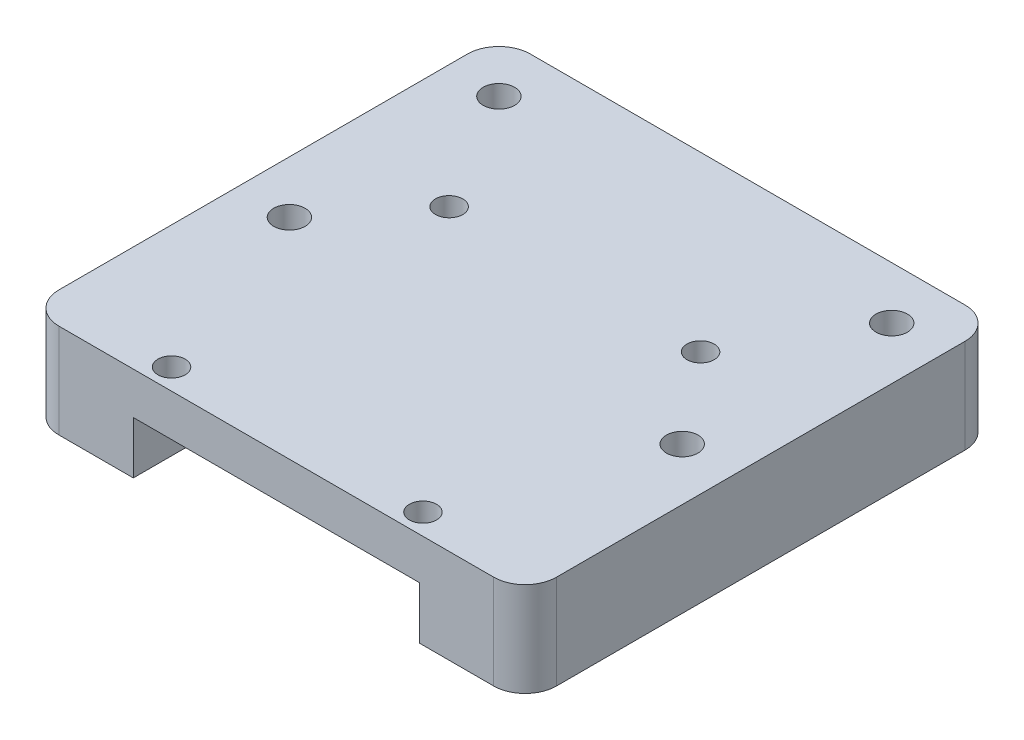
ISO-10303-21;
HEADER;
FILE_DESCRIPTION(('STEP AP214'),'2;1');
FILE_NAME('part.step','',(''),(''),'','','');
FILE_SCHEMA(('AUTOMOTIVE_DESIGN { 1 0 10303 214 1 1 1 1 }'));
ENDSEC;
DATA;
#1=APPLICATION_CONTEXT('core data for automotive mechanical design processes');
#2=APPLICATION_PROTOCOL_DEFINITION('international standard','automotive_design',2000,#1);
#3=PRODUCT_CONTEXT('',#1,'mechanical');
#4=PRODUCT('Part','Part','',(#3));
#5=PRODUCT_RELATED_PRODUCT_CATEGORY('part','',(#4));
#6=PRODUCT_DEFINITION_FORMATION('','',#4);
#7=PRODUCT_DEFINITION_CONTEXT('part definition',#1,'design');
#8=PRODUCT_DEFINITION('design','',#6,#7);
#9=PRODUCT_DEFINITION_SHAPE('','',#8);
#10=(LENGTH_UNIT() NAMED_UNIT(*) SI_UNIT(.MILLI.,.METRE.));
#11=(NAMED_UNIT(*) PLANE_ANGLE_UNIT() SI_UNIT($,.RADIAN.));
#12=(NAMED_UNIT(*) SI_UNIT($,.STERADIAN.) SOLID_ANGLE_UNIT());
#13=UNCERTAINTY_MEASURE_WITH_UNIT(LENGTH_MEASURE(1.E-05),#10,'distance_accuracy_value','');
#14=(GEOMETRIC_REPRESENTATION_CONTEXT(3) GLOBAL_UNCERTAINTY_ASSIGNED_CONTEXT((#13)) GLOBAL_UNIT_ASSIGNED_CONTEXT((#10,
#11,#12)) REPRESENTATION_CONTEXT('',''));
#15=CARTESIAN_POINT('',(0.,0.,0.));
#16=DIRECTION('',(0.,0.,1.));
#17=DIRECTION('',(1.,0.,0.));
#18=AXIS2_PLACEMENT_3D('',#15,#16,#17);
#19=CARTESIAN_POINT('',(0.,9.,0.));
#20=DIRECTION('',(0.,1.,0.));
#21=DIRECTION('',(0.,0.,1.));
#22=AXIS2_PLACEMENT_3D('',#19,#20,#21);
#23=PLANE('',#22);
#24=CARTESIAN_POINT('',(12.,9.,-6.00000000000002));
#25=DIRECTION('',(0.,1.,0.));
#26=DIRECTION('',(0.,0.,-1.));
#27=AXIS2_PLACEMENT_3D('',#24,#25,#26);
#28=CIRCLE('',#27,1.3);
#29=CARTESIAN_POINT('',(12.,9.,-7.30000000000002));
#30=VERTEX_POINT('',#29);
#31=EDGE_CURVE('E190',#30,#30,#28,.T.);
#32=ORIENTED_EDGE('',*,*,#31,.F.);
#33=EDGE_LOOP('',(#32));
#34=FACE_BOUND('',#33,.T.);
#35=CARTESIAN_POINT('',(-12.,9.,20.5));
#36=DIRECTION('',(0.,1.,0.));
#37=DIRECTION('',(0.,0.,1.));
#38=AXIS2_PLACEMENT_3D('',#35,#36,#37);
#39=CIRCLE('',#38,1.3);
#40=CARTESIAN_POINT('',(-12.,9.,21.8));
#41=VERTEX_POINT('',#40);
#42=EDGE_CURVE('E198',#41,#41,#39,.T.);
#43=ORIENTED_EDGE('',*,*,#42,.F.);
#44=EDGE_LOOP('',(#43));
#45=FACE_BOUND('',#44,.T.);
#46=CARTESIAN_POINT('',(18.75,9.,2.5));
#47=DIRECTION('',(0.,1.,0.));
#48=DIRECTION('',(0.,0.,-1.));
#49=AXIS2_PLACEMENT_3D('',#46,#47,#48);
#50=CIRCLE('',#49,1.5);
#51=CARTESIAN_POINT('',(18.75,9.,1.));
#52=VERTEX_POINT('',#51);
#53=EDGE_CURVE('E211',#52,#52,#50,.T.);
#54=ORIENTED_EDGE('',*,*,#53,.F.);
#55=EDGE_LOOP('',(#54));
#56=FACE_BOUND('',#55,.T.);
#57=CARTESIAN_POINT('',(-18.75,9.,-17.5));
#58=DIRECTION('',(0.,1.,0.));
#59=DIRECTION('',(0.,0.,1.));
#60=AXIS2_PLACEMENT_3D('',#57,#58,#59);
#61=CIRCLE('',#60,1.5);
#62=CARTESIAN_POINT('',(-18.75,9.,-16.));
#63=VERTEX_POINT('',#62);
#64=EDGE_CURVE('E227',#63,#63,#61,.T.);
#65=ORIENTED_EDGE('',*,*,#64,.F.);
#66=EDGE_LOOP('',(#65));
#67=FACE_BOUND('',#66,.T.);
#68=DIRECTION('',(1.,0.,0.));
#69=VECTOR('',#68,1.);
#70=CARTESIAN_POINT('',(-23.75,9.,22.5));
#71=LINE('',#70,#69);
#72=CARTESIAN_POINT('',(-20.75,9.,22.5));
#73=VERTEX_POINT('',#72);
#74=CARTESIAN_POINT('',(20.75,9.,22.5));
#75=VERTEX_POINT('',#74);
#76=EDGE_CURVE('E245',#73,#75,#71,.T.);
#77=ORIENTED_EDGE('',*,*,#76,.T.);
#78=CARTESIAN_POINT('',(20.75,9.,19.5));
#79=DIRECTION('',(0.,1.,0.));
#80=DIRECTION('',(0.,0.,1.));
#81=AXIS2_PLACEMENT_3D('',#78,#79,#80);
#82=CIRCLE('',#81,3.);
#83=CARTESIAN_POINT('',(23.75,9.,19.5));
#84=VERTEX_POINT('',#83);
#85=EDGE_CURVE('E298',#75,#84,#82,.T.);
#86=ORIENTED_EDGE('',*,*,#85,.T.);
#87=DIRECTION('',(0.,0.,-1.));
#88=VECTOR('',#87,1.);
#89=CARTESIAN_POINT('',(23.75,9.,-22.5));
#90=LINE('',#89,#88);
#91=CARTESIAN_POINT('',(23.75,9.,-19.5));
#92=VERTEX_POINT('',#91);
#93=EDGE_CURVE('E235',#84,#92,#90,.T.);
#94=ORIENTED_EDGE('',*,*,#93,.T.);
#95=CARTESIAN_POINT('',(20.75,9.,-19.5));
#96=DIRECTION('',(0.,1.,0.));
#97=DIRECTION('',(0.,0.,1.));
#98=AXIS2_PLACEMENT_3D('',#95,#96,#97);
#99=CIRCLE('',#98,3.);
#100=CARTESIAN_POINT('',(20.75,9.,-22.5));
#101=VERTEX_POINT('',#100);
#102=EDGE_CURVE('E295',#92,#101,#99,.T.);
#103=ORIENTED_EDGE('',*,*,#102,.T.);
#104=DIRECTION('',(-1.,0.,0.));
#105=VECTOR('',#104,1.);
#106=CARTESIAN_POINT('',(-23.75,9.,-22.5));
#107=LINE('',#106,#105);
#108=CARTESIAN_POINT('',(-20.75,9.,-22.5));
#109=VERTEX_POINT('',#108);
#110=EDGE_CURVE('E239',#101,#109,#107,.T.);
#111=ORIENTED_EDGE('',*,*,#110,.T.);
#112=CARTESIAN_POINT('',(-20.75,9.,-19.5));
#113=DIRECTION('',(0.,1.,0.));
#114=DIRECTION('',(0.,0.,1.));
#115=AXIS2_PLACEMENT_3D('',#112,#113,#114);
#116=CIRCLE('',#115,3.);
#117=CARTESIAN_POINT('',(-23.75,9.,-19.5));
#118=VERTEX_POINT('',#117);
#119=EDGE_CURVE('E65',#109,#118,#116,.T.);
#120=ORIENTED_EDGE('',*,*,#119,.T.);
#121=DIRECTION('',(0.,0.,1.));
#122=VECTOR('',#121,1.);
#123=CARTESIAN_POINT('',(-23.75,9.,-22.5));
#124=LINE('',#123,#122);
#125=CARTESIAN_POINT('',(-23.75,9.,19.5));
#126=VERTEX_POINT('',#125);
#127=EDGE_CURVE('E242',#118,#126,#124,.T.);
#128=ORIENTED_EDGE('',*,*,#127,.T.);
#129=CARTESIAN_POINT('',(-20.75,9.,19.5));
#130=DIRECTION('',(0.,1.,0.));
#131=DIRECTION('',(0.,0.,1.));
#132=AXIS2_PLACEMENT_3D('',#129,#130,#131);
#133=CIRCLE('',#132,3.);
#134=EDGE_CURVE('E290',#126,#73,#133,.T.);
#135=ORIENTED_EDGE('',*,*,#134,.T.);
#136=EDGE_LOOP('',(#77,#86,#94,#103,#111,#120,#128,#135));
#137=FACE_BOUND('',#136,.T.);
#138=CARTESIAN_POINT('',(-18.75,9.,2.50000000000001));
#139=DIRECTION('',(0.,1.,0.));
#140=DIRECTION('',(0.,0.,1.));
#141=AXIS2_PLACEMENT_3D('',#138,#139,#140);
#142=CIRCLE('',#141,1.5);
#143=CARTESIAN_POINT('',(-18.75,9.,4.00000000000001));
#144=VERTEX_POINT('',#143);
#145=EDGE_CURVE('E219',#144,#144,#142,.T.);
#146=ORIENTED_EDGE('',*,*,#145,.F.);
#147=EDGE_LOOP('',(#146));
#148=FACE_BOUND('',#147,.T.);
#149=CARTESIAN_POINT('',(18.75,9.,-17.5));
#150=DIRECTION('',(0.,1.,0.));
#151=DIRECTION('',(0.,0.,-1.));
#152=AXIS2_PLACEMENT_3D('',#149,#150,#151);
#153=CIRCLE('',#152,1.5);
#154=CARTESIAN_POINT('',(18.75,9.,-19.));
#155=VERTEX_POINT('',#154);
#156=EDGE_CURVE('E203',#155,#155,#153,.T.);
#157=ORIENTED_EDGE('',*,*,#156,.F.);
#158=EDGE_LOOP('',(#157));
#159=FACE_BOUND('',#158,.T.);
#160=CARTESIAN_POINT('',(-12.,9.,-6.));
#161=DIRECTION('',(0.,1.,0.));
#162=DIRECTION('',(0.,0.,1.));
#163=AXIS2_PLACEMENT_3D('',#160,#161,#162);
#164=CIRCLE('',#163,1.3);
#165=CARTESIAN_POINT('',(-12.,9.,-4.7));
#166=VERTEX_POINT('',#165);
#167=EDGE_CURVE('E194',#166,#166,#164,.T.);
#168=ORIENTED_EDGE('',*,*,#167,.F.);
#169=EDGE_LOOP('',(#168));
#170=FACE_BOUND('',#169,.T.);
#171=CARTESIAN_POINT('',(12.,9.,20.5));
#172=DIRECTION('',(0.,1.,0.));
#173=DIRECTION('',(0.,0.,-1.));
#174=AXIS2_PLACEMENT_3D('',#171,#172,#173);
#175=CIRCLE('',#174,1.3);
#176=CARTESIAN_POINT('',(12.,9.,19.2));
#177=VERTEX_POINT('',#176);
#178=EDGE_CURVE('E186',#177,#177,#175,.T.);
#179=ORIENTED_EDGE('',*,*,#178,.F.);
#180=EDGE_LOOP('',(#179));
#181=FACE_BOUND('',#180,.T.);
#182=ADVANCED_FACE('F43',(#34,#45,#56,#67,#137,#148,#159,#170,#181),#23,.T.);
#183=CARTESIAN_POINT('',(0.,0.,0.));
#184=DIRECTION('',(0.,1.,0.));
#185=DIRECTION('',(0.,0.,1.));
#186=AXIS2_PLACEMENT_3D('',#183,#184,#185);
#187=PLANE('',#186);
#188=DIRECTION('',(0.,0.,-1.));
#189=VECTOR('',#188,1.);
#190=CARTESIAN_POINT('',(23.75,0.,-22.5));
#191=LINE('',#190,#189);
#192=CARTESIAN_POINT('',(23.75,0.,19.5));
#193=VERTEX_POINT('',#192);
#194=CARTESIAN_POINT('',(23.75,0.,-19.5));
#195=VERTEX_POINT('',#194);
#196=EDGE_CURVE('E231',#193,#195,#191,.T.);
#197=ORIENTED_EDGE('',*,*,#196,.F.);
#198=CARTESIAN_POINT('',(20.75,0.,19.5));
#199=DIRECTION('',(0.,1.,0.));
#200=DIRECTION('',(0.,0.,1.));
#201=AXIS2_PLACEMENT_3D('',#198,#199,#200);
#202=CIRCLE('',#201,3.);
#203=CARTESIAN_POINT('',(20.75,0.,22.5));
#204=VERTEX_POINT('',#203);
#205=EDGE_CURVE('E281',#193,#204,#202,.F.);
#206=ORIENTED_EDGE('',*,*,#205,.T.);
#207=DIRECTION('',(1.,0.,0.));
#208=VECTOR('',#207,1.);
#209=CARTESIAN_POINT('',(-23.75,0.,22.5));
#210=LINE('',#209,#208);
#211=CARTESIAN_POINT('',(13.65,0.,22.5));
#212=VERTEX_POINT('',#211);
#213=EDGE_CURVE('E260',#212,#204,#210,.T.);
#214=ORIENTED_EDGE('',*,*,#213,.F.);
#215=DIRECTION('',(0.,0.,1.));
#216=VECTOR('',#215,1.);
#217=CARTESIAN_POINT('',(13.65,0.,-13.5));
#218=LINE('',#217,#216);
#219=CARTESIAN_POINT('',(13.65,0.,-13.5));
#220=VERTEX_POINT('',#219);
#221=EDGE_CURVE('E319',#220,#212,#218,.T.);
#222=ORIENTED_EDGE('',*,*,#221,.F.);
#223=DIRECTION('',(1.,0.,0.));
#224=VECTOR('',#223,1.);
#225=CARTESIAN_POINT('',(-13.65,0.,-13.5));
#226=LINE('',#225,#224);
#227=CARTESIAN_POINT('',(-13.65,0.,-13.5));
#228=VERTEX_POINT('',#227);
#229=EDGE_CURVE('E313',#228,#220,#226,.T.);
#230=ORIENTED_EDGE('',*,*,#229,.F.);
#231=DIRECTION('',(0.,0.,-1.));
#232=VECTOR('',#231,1.);
#233=CARTESIAN_POINT('',(-13.65,0.,-13.5));
#234=LINE('',#233,#232);
#235=CARTESIAN_POINT('',(-13.65,0.,22.5));
#236=VERTEX_POINT('',#235);
#237=EDGE_CURVE('E316',#236,#228,#234,.T.);
#238=ORIENTED_EDGE('',*,*,#237,.F.);
#239=CARTESIAN_POINT('',(-20.75,0.,22.5));
#240=VERTEX_POINT('',#239);
#241=EDGE_CURVE('E162',#240,#236,#210,.T.);
#242=ORIENTED_EDGE('',*,*,#241,.F.);
#243=CARTESIAN_POINT('',(-20.75,0.,19.5));
#244=DIRECTION('',(0.,1.,0.));
#245=DIRECTION('',(0.,0.,1.));
#246=AXIS2_PLACEMENT_3D('',#243,#244,#245);
#247=CIRCLE('',#246,3.);
#248=CARTESIAN_POINT('',(-23.75,0.,19.5));
#249=VERTEX_POINT('',#248);
#250=EDGE_CURVE('E272',#240,#249,#247,.F.);
#251=ORIENTED_EDGE('',*,*,#250,.T.);
#252=DIRECTION('',(0.,0.,1.));
#253=VECTOR('',#252,1.);
#254=CARTESIAN_POINT('',(-23.75,0.,-22.5));
#255=LINE('',#254,#253);
#256=CARTESIAN_POINT('',(-23.75,0.,-19.5));
#257=VERTEX_POINT('',#256);
#258=EDGE_CURVE('E257',#257,#249,#255,.T.);
#259=ORIENTED_EDGE('',*,*,#258,.F.);
#260=CARTESIAN_POINT('',(-20.75,0.,-19.5));
#261=DIRECTION('',(0.,1.,0.));
#262=DIRECTION('',(0.,0.,1.));
#263=AXIS2_PLACEMENT_3D('',#260,#261,#262);
#264=CIRCLE('',#263,3.);
#265=CARTESIAN_POINT('',(-20.75,0.,-22.5));
#266=VERTEX_POINT('',#265);
#267=EDGE_CURVE('E275',#257,#266,#264,.F.);
#268=ORIENTED_EDGE('',*,*,#267,.T.);
#269=DIRECTION('',(-1.,0.,0.));
#270=VECTOR('',#269,1.);
#271=CARTESIAN_POINT('',(-23.75,0.,-22.5));
#272=LINE('',#271,#270);
#273=CARTESIAN_POINT('',(20.75,0.,-22.5));
#274=VERTEX_POINT('',#273);
#275=EDGE_CURVE('E253',#274,#266,#272,.T.);
#276=ORIENTED_EDGE('',*,*,#275,.F.);
#277=CARTESIAN_POINT('',(20.75,0.,-19.5));
#278=DIRECTION('',(0.,1.,0.));
#279=DIRECTION('',(0.,0.,1.));
#280=AXIS2_PLACEMENT_3D('',#277,#278,#279);
#281=CIRCLE('',#280,3.);
#282=EDGE_CURVE('E278',#274,#195,#281,.F.);
#283=ORIENTED_EDGE('',*,*,#282,.T.);
#284=EDGE_LOOP('',(#197,#206,#214,#222,#230,#238,#242,#251,#259,#268,#276,#283));
#285=FACE_BOUND('',#284,.T.);
#286=CARTESIAN_POINT('',(-18.75,0.,-17.5));
#287=DIRECTION('',(0.,1.,0.));
#288=DIRECTION('',(0.,0.,1.));
#289=AXIS2_PLACEMENT_3D('',#286,#287,#288);
#290=CIRCLE('',#289,1.5);
#291=CARTESIAN_POINT('',(-18.75,0.,-16.));
#292=VERTEX_POINT('',#291);
#293=EDGE_CURVE('E223',#292,#292,#290,.T.);
#294=ORIENTED_EDGE('',*,*,#293,.T.);
#295=EDGE_LOOP('',(#294));
#296=FACE_BOUND('',#295,.T.);
#297=CARTESIAN_POINT('',(-18.75,0.,2.50000000000001));
#298=DIRECTION('',(0.,1.,0.));
#299=DIRECTION('',(0.,0.,1.));
#300=AXIS2_PLACEMENT_3D('',#297,#298,#299);
#301=CIRCLE('',#300,1.5);
#302=CARTESIAN_POINT('',(-18.75,0.,4.00000000000001));
#303=VERTEX_POINT('',#302);
#304=EDGE_CURVE('E215',#303,#303,#301,.T.);
#305=ORIENTED_EDGE('',*,*,#304,.T.);
#306=EDGE_LOOP('',(#305));
#307=FACE_BOUND('',#306,.T.);
#308=CARTESIAN_POINT('',(18.75,0.,2.5));
#309=DIRECTION('',(0.,1.,0.));
#310=DIRECTION('',(0.,0.,-1.));
#311=AXIS2_PLACEMENT_3D('',#308,#309,#310);
#312=CIRCLE('',#311,1.5);
#313=CARTESIAN_POINT('',(18.75,0.,1.));
#314=VERTEX_POINT('',#313);
#315=EDGE_CURVE('E207',#314,#314,#312,.T.);
#316=ORIENTED_EDGE('',*,*,#315,.T.);
#317=EDGE_LOOP('',(#316));
#318=FACE_BOUND('',#317,.T.);
#319=CARTESIAN_POINT('',(18.75,0.,-17.5));
#320=DIRECTION('',(0.,1.,0.));
#321=DIRECTION('',(0.,0.,-1.));
#322=AXIS2_PLACEMENT_3D('',#319,#320,#321);
#323=CIRCLE('',#322,1.5);
#324=CARTESIAN_POINT('',(18.75,0.,-19.));
#325=VERTEX_POINT('',#324);
#326=EDGE_CURVE('E202',#325,#325,#323,.T.);
#327=ORIENTED_EDGE('',*,*,#326,.T.);
#328=EDGE_LOOP('',(#327));
#329=FACE_BOUND('',#328,.T.);
#330=ADVANCED_FACE('F334',(#285,#296,#307,#318,#329),#187,.F.);
#331=CARTESIAN_POINT('',(23.75,9.,-22.5));
#332=DIRECTION('',(-1.,0.,0.));
#333=DIRECTION('',(0.,0.,1.));
#334=AXIS2_PLACEMENT_3D('',#331,#332,#333);
#335=PLANE('',#334);
#336=ORIENTED_EDGE('',*,*,#93,.F.);
#337=DIRECTION('',(0.,-1.,0.));
#338=VECTOR('',#337,1.);
#339=CARTESIAN_POINT('',(23.75,9.,19.5));
#340=LINE('',#339,#338);
#341=EDGE_CURVE('E268',#84,#193,#340,.T.);
#342=ORIENTED_EDGE('',*,*,#341,.T.);
#343=ORIENTED_EDGE('',*,*,#196,.T.);
#344=DIRECTION('',(0.,-1.,0.));
#345=VECTOR('',#344,1.);
#346=CARTESIAN_POINT('',(23.75,9.,-19.5));
#347=LINE('',#346,#345);
#348=EDGE_CURVE('E249',#195,#92,#347,.F.);
#349=ORIENTED_EDGE('',*,*,#348,.T.);
#350=EDGE_LOOP('',(#336,#342,#343,#349));
#351=FACE_BOUND('',#350,.T.);
#352=ADVANCED_FACE('F342',(#351),#335,.F.);
#353=CARTESIAN_POINT('',(-23.75,9.,-22.5));
#354=DIRECTION('',(0.,0.,1.));
#355=DIRECTION('',(1.,0.,0.));
#356=AXIS2_PLACEMENT_3D('',#353,#354,#355);
#357=PLANE('',#356);
#358=ORIENTED_EDGE('',*,*,#110,.F.);
#359=DIRECTION('',(0.,-1.,0.));
#360=VECTOR('',#359,1.);
#361=CARTESIAN_POINT('',(20.75,9.,-22.5));
#362=LINE('',#361,#360);
#363=EDGE_CURVE('E304',#101,#274,#362,.T.);
#364=ORIENTED_EDGE('',*,*,#363,.T.);
#365=ORIENTED_EDGE('',*,*,#275,.T.);
#366=DIRECTION('',(0.,-1.,0.));
#367=VECTOR('',#366,1.);
#368=CARTESIAN_POINT('',(-20.75,9.,-22.5));
#369=LINE('',#368,#367);
#370=EDGE_CURVE('E301',#266,#109,#369,.F.);
#371=ORIENTED_EDGE('',*,*,#370,.T.);
#372=EDGE_LOOP('',(#358,#364,#365,#371));
#373=FACE_BOUND('',#372,.T.);
#374=ADVANCED_FACE('F352',(#373),#357,.F.);
#375=CARTESIAN_POINT('',(-23.75,9.,-22.5));
#376=DIRECTION('',(1.,0.,0.));
#377=DIRECTION('',(0.,0.,-1.));
#378=AXIS2_PLACEMENT_3D('',#375,#376,#377);
#379=PLANE('',#378);
#380=ORIENTED_EDGE('',*,*,#127,.F.);
#381=DIRECTION('',(0.,-1.,0.));
#382=VECTOR('',#381,1.);
#383=CARTESIAN_POINT('',(-23.75,9.,-19.5));
#384=LINE('',#383,#382);
#385=EDGE_CURVE('E11',#118,#257,#384,.T.);
#386=ORIENTED_EDGE('',*,*,#385,.T.);
#387=ORIENTED_EDGE('',*,*,#258,.T.);
#388=DIRECTION('',(0.,-1.,0.));
#389=VECTOR('',#388,1.);
#390=CARTESIAN_POINT('',(-23.75,9.,19.5));
#391=LINE('',#390,#389);
#392=EDGE_CURVE('E52',#249,#126,#391,.F.);
#393=ORIENTED_EDGE('',*,*,#392,.T.);
#394=EDGE_LOOP('',(#380,#386,#387,#393));
#395=FACE_BOUND('',#394,.T.);
#396=ADVANCED_FACE('F358',(#395),#379,.F.);
#397=CARTESIAN_POINT('',(-23.75,9.,22.5));
#398=DIRECTION('',(0.,0.,-1.));
#399=DIRECTION('',(-1.,0.,0.));
#400=AXIS2_PLACEMENT_3D('',#397,#398,#399);
#401=PLANE('',#400);
#402=ORIENTED_EDGE('',*,*,#213,.T.);
#403=DIRECTION('',(0.,-1.,0.));
#404=VECTOR('',#403,1.);
#405=CARTESIAN_POINT('',(20.75,9.,22.5));
#406=LINE('',#405,#404);
#407=EDGE_CURVE('E287',#204,#75,#406,.F.);
#408=ORIENTED_EDGE('',*,*,#407,.T.);
#409=ORIENTED_EDGE('',*,*,#76,.F.);
#410=DIRECTION('',(0.,-1.,0.));
#411=VECTOR('',#410,1.);
#412=CARTESIAN_POINT('',(-20.75,9.,22.5));
#413=LINE('',#412,#411);
#414=EDGE_CURVE('E284',#73,#240,#413,.T.);
#415=ORIENTED_EDGE('',*,*,#414,.T.);
#416=ORIENTED_EDGE('',*,*,#241,.T.);
#417=DIRECTION('',(0.,-1.,0.));
#418=VECTOR('',#417,1.);
#419=CARTESIAN_POINT('',(-13.65,5.,22.5));
#420=LINE('',#419,#418);
#421=CARTESIAN_POINT('',(-13.65,5.,22.5));
#422=VERTEX_POINT('',#421);
#423=EDGE_CURVE('E139',#422,#236,#420,.T.);
#424=ORIENTED_EDGE('',*,*,#423,.F.);
#425=DIRECTION('',(-1.,0.,0.));
#426=VECTOR('',#425,1.);
#427=CARTESIAN_POINT('',(-13.65,5.,22.5));
#428=LINE('',#427,#426);
#429=CARTESIAN_POINT('',(13.65,5.,22.5));
#430=VERTEX_POINT('',#429);
#431=EDGE_CURVE('E147',#430,#422,#428,.T.);
#432=ORIENTED_EDGE('',*,*,#431,.F.);
#433=DIRECTION('',(0.,-1.,0.));
#434=VECTOR('',#433,1.);
#435=CARTESIAN_POINT('',(13.65,5.,22.5));
#436=LINE('',#435,#434);
#437=EDGE_CURVE('E164',#430,#212,#436,.T.);
#438=ORIENTED_EDGE('',*,*,#437,.T.);
#439=EDGE_LOOP('',(#402,#408,#409,#415,#416,#424,#432,#438));
#440=FACE_BOUND('',#439,.T.);
#441=ADVANCED_FACE('F159',(#440),#401,.F.);
#442=CARTESIAN_POINT('',(-18.75,9.,-17.5));
#443=DIRECTION('',(0.,-1.,0.));
#444=DIRECTION('',(0.,0.,-1.));
#445=AXIS2_PLACEMENT_3D('',#442,#443,#444);
#446=CYLINDRICAL_SURFACE('',#445,1.5);
#447=ORIENTED_EDGE('',*,*,#64,.T.);
#448=EDGE_LOOP('',(#447));
#449=FACE_BOUND('',#448,.T.);
#450=ORIENTED_EDGE('',*,*,#293,.F.);
#451=EDGE_LOOP('',(#450));
#452=FACE_BOUND('',#451,.T.);
#453=ADVANCED_FACE('F377',(#449,#452),#446,.F.);
#454=CARTESIAN_POINT('',(-18.75,9.,2.50000000000001));
#455=DIRECTION('',(0.,-1.,0.));
#456=DIRECTION('',(0.,0.,-1.));
#457=AXIS2_PLACEMENT_3D('',#454,#455,#456);
#458=CYLINDRICAL_SURFACE('',#457,1.5);
#459=ORIENTED_EDGE('',*,*,#145,.T.);
#460=EDGE_LOOP('',(#459));
#461=FACE_BOUND('',#460,.T.);
#462=ORIENTED_EDGE('',*,*,#304,.F.);
#463=EDGE_LOOP('',(#462));
#464=FACE_BOUND('',#463,.T.);
#465=ADVANCED_FACE('F509',(#461,#464),#458,.F.);
#466=CARTESIAN_POINT('',(18.75,9.,2.5));
#467=DIRECTION('',(0.,-1.,0.));
#468=DIRECTION('',(0.,0.,-1.));
#469=AXIS2_PLACEMENT_3D('',#466,#467,#468);
#470=CYLINDRICAL_SURFACE('',#469,1.5);
#471=ORIENTED_EDGE('',*,*,#53,.T.);
#472=EDGE_LOOP('',(#471));
#473=FACE_BOUND('',#472,.T.);
#474=ORIENTED_EDGE('',*,*,#315,.F.);
#475=EDGE_LOOP('',(#474));
#476=FACE_BOUND('',#475,.T.);
#477=ADVANCED_FACE('F499',(#473,#476),#470,.F.);
#478=CARTESIAN_POINT('',(18.75,9.,-17.5));
#479=DIRECTION('',(0.,-1.,0.));
#480=DIRECTION('',(0.,0.,-1.));
#481=AXIS2_PLACEMENT_3D('',#478,#479,#480);
#482=CYLINDRICAL_SURFACE('',#481,1.5);
#483=ORIENTED_EDGE('',*,*,#156,.T.);
#484=EDGE_LOOP('',(#483));
#485=FACE_BOUND('',#484,.T.);
#486=ORIENTED_EDGE('',*,*,#326,.F.);
#487=EDGE_LOOP('',(#486));
#488=FACE_BOUND('',#487,.T.);
#489=ADVANCED_FACE('F489',(#485,#488),#482,.F.);
#490=CARTESIAN_POINT('',(-12.,9.,20.5));
#491=DIRECTION('',(0.,-1.,0.));
#492=DIRECTION('',(0.,0.,-1.));
#493=AXIS2_PLACEMENT_3D('',#490,#491,#492);
#494=CYLINDRICAL_SURFACE('',#493,1.3);
#495=CARTESIAN_POINT('',(-12.,5.,20.5));
#496=DIRECTION('',(0.,1.,0.));
#497=DIRECTION('',(0.,0.,1.));
#498=AXIS2_PLACEMENT_3D('',#495,#496,#497);
#499=CIRCLE('',#498,1.3);
#500=CARTESIAN_POINT('',(-12.,5.,21.8));
#501=VERTEX_POINT('',#500);
#502=EDGE_CURVE('E182',#501,#501,#499,.T.);
#503=ORIENTED_EDGE('',*,*,#502,.F.);
#504=EDGE_LOOP('',(#503));
#505=FACE_BOUND('',#504,.T.);
#506=ORIENTED_EDGE('',*,*,#42,.T.);
#507=EDGE_LOOP('',(#506));
#508=FACE_BOUND('',#507,.T.);
#509=ADVANCED_FACE('F479',(#505,#508),#494,.F.);
#510=CARTESIAN_POINT('',(-12.,9.,-6.));
#511=DIRECTION('',(0.,-1.,0.));
#512=DIRECTION('',(0.,0.,-1.));
#513=AXIS2_PLACEMENT_3D('',#510,#511,#512);
#514=CYLINDRICAL_SURFACE('',#513,1.3);
#515=CARTESIAN_POINT('',(-12.,5.,-6.));
#516=DIRECTION('',(0.,1.,0.));
#517=DIRECTION('',(0.,0.,1.));
#518=AXIS2_PLACEMENT_3D('',#515,#516,#517);
#519=CIRCLE('',#518,1.3);
#520=CARTESIAN_POINT('',(-12.,5.,-4.7));
#521=VERTEX_POINT('',#520);
#522=EDGE_CURVE('E177',#521,#521,#519,.T.);
#523=ORIENTED_EDGE('',*,*,#522,.F.);
#524=EDGE_LOOP('',(#523));
#525=FACE_BOUND('',#524,.T.);
#526=ORIENTED_EDGE('',*,*,#167,.T.);
#527=EDGE_LOOP('',(#526));
#528=FACE_BOUND('',#527,.T.);
#529=ADVANCED_FACE('F469',(#525,#528),#514,.F.);
#530=CARTESIAN_POINT('',(12.,9.,-6.00000000000002));
#531=DIRECTION('',(0.,-1.,0.));
#532=DIRECTION('',(0.,0.,-1.));
#533=AXIS2_PLACEMENT_3D('',#530,#531,#532);
#534=CYLINDRICAL_SURFACE('',#533,1.3);
#535=CARTESIAN_POINT('',(12.,5.,-6.00000000000002));
#536=DIRECTION('',(0.,1.,0.));
#537=DIRECTION('',(0.,0.,1.));
#538=AXIS2_PLACEMENT_3D('',#535,#536,#537);
#539=CIRCLE('',#538,1.3);
#540=CARTESIAN_POINT('',(12.,5.,-4.70000000000002));
#541=VERTEX_POINT('',#540);
#542=EDGE_CURVE('E173',#541,#541,#539,.T.);
#543=ORIENTED_EDGE('',*,*,#542,.F.);
#544=EDGE_LOOP('',(#543));
#545=FACE_BOUND('',#544,.T.);
#546=ORIENTED_EDGE('',*,*,#31,.T.);
#547=EDGE_LOOP('',(#546));
#548=FACE_BOUND('',#547,.T.);
#549=ADVANCED_FACE('F459',(#545,#548),#534,.F.);
#550=CARTESIAN_POINT('',(12.,9.,20.5));
#551=DIRECTION('',(0.,-1.,0.));
#552=DIRECTION('',(0.,0.,-1.));
#553=AXIS2_PLACEMENT_3D('',#550,#551,#552);
#554=CYLINDRICAL_SURFACE('',#553,1.3);
#555=CARTESIAN_POINT('',(12.,5.,20.5));
#556=DIRECTION('',(0.,1.,0.));
#557=DIRECTION('',(0.,0.,1.));
#558=AXIS2_PLACEMENT_3D('',#555,#556,#557);
#559=CIRCLE('',#558,1.3);
#560=CARTESIAN_POINT('',(12.,5.,21.8));
#561=VERTEX_POINT('',#560);
#562=EDGE_CURVE('E178',#561,#561,#559,.T.);
#563=ORIENTED_EDGE('',*,*,#562,.F.);
#564=EDGE_LOOP('',(#563));
#565=FACE_BOUND('',#564,.T.);
#566=ORIENTED_EDGE('',*,*,#178,.T.);
#567=EDGE_LOOP('',(#566));
#568=FACE_BOUND('',#567,.T.);
#569=ADVANCED_FACE('F450',(#565,#568),#554,.F.);
#570=CARTESIAN_POINT('',(13.65,5.,-13.5));
#571=DIRECTION('',(1.,0.,0.));
#572=DIRECTION('',(0.,0.,-1.));
#573=AXIS2_PLACEMENT_3D('',#570,#571,#572);
#574=PLANE('',#573);
#575=ORIENTED_EDGE('',*,*,#221,.T.);
#576=ORIENTED_EDGE('',*,*,#437,.F.);
#577=DIRECTION('',(0.,0.,1.));
#578=VECTOR('',#577,1.);
#579=CARTESIAN_POINT('',(13.65,5.,-13.5));
#580=LINE('',#579,#578);
#581=CARTESIAN_POINT('',(13.65,5.,-13.5));
#582=VERTEX_POINT('',#581);
#583=EDGE_CURVE('E152',#582,#430,#580,.T.);
#584=ORIENTED_EDGE('',*,*,#583,.F.);
#585=DIRECTION('',(0.,-1.,0.));
#586=VECTOR('',#585,1.);
#587=CARTESIAN_POINT('',(13.65,5.,-13.5));
#588=LINE('',#587,#586);
#589=EDGE_CURVE('E168',#582,#220,#588,.T.);
#590=ORIENTED_EDGE('',*,*,#589,.T.);
#591=EDGE_LOOP('',(#575,#576,#584,#590));
#592=FACE_BOUND('',#591,.T.);
#593=ADVANCED_FACE('F329',(#592),#574,.F.);
#594=CARTESIAN_POINT('',(-13.65,5.,-13.5));
#595=DIRECTION('',(0.,0.,-1.));
#596=DIRECTION('',(-1.,0.,0.));
#597=AXIS2_PLACEMENT_3D('',#594,#595,#596);
#598=PLANE('',#597);
#599=ORIENTED_EDGE('',*,*,#229,.T.);
#600=ORIENTED_EDGE('',*,*,#589,.F.);
#601=DIRECTION('',(1.,0.,0.));
#602=VECTOR('',#601,1.);
#603=CARTESIAN_POINT('',(-13.65,5.,-13.5));
#604=LINE('',#603,#602);
#605=CARTESIAN_POINT('',(-13.65,5.,-13.5));
#606=VERTEX_POINT('',#605);
#607=EDGE_CURVE('E146',#606,#582,#604,.T.);
#608=ORIENTED_EDGE('',*,*,#607,.F.);
#609=DIRECTION('',(0.,-1.,0.));
#610=VECTOR('',#609,1.);
#611=CARTESIAN_POINT('',(-13.65,5.,-13.5));
#612=LINE('',#611,#610);
#613=EDGE_CURVE('E141',#606,#228,#612,.T.);
#614=ORIENTED_EDGE('',*,*,#613,.T.);
#615=EDGE_LOOP('',(#599,#600,#608,#614));
#616=FACE_BOUND('',#615,.T.);
#617=ADVANCED_FACE('F326',(#616),#598,.F.);
#618=CARTESIAN_POINT('',(-13.65,5.,-13.5));
#619=DIRECTION('',(-1.,0.,0.));
#620=DIRECTION('',(0.,0.,1.));
#621=AXIS2_PLACEMENT_3D('',#618,#619,#620);
#622=PLANE('',#621);
#623=ORIENTED_EDGE('',*,*,#237,.T.);
#624=ORIENTED_EDGE('',*,*,#613,.F.);
#625=DIRECTION('',(0.,0.,-1.));
#626=VECTOR('',#625,1.);
#627=CARTESIAN_POINT('',(-13.65,5.,-13.5));
#628=LINE('',#627,#626);
#629=EDGE_CURVE('E134',#422,#606,#628,.T.);
#630=ORIENTED_EDGE('',*,*,#629,.F.);
#631=ORIENTED_EDGE('',*,*,#423,.T.);
#632=EDGE_LOOP('',(#623,#624,#630,#631));
#633=FACE_BOUND('',#632,.T.);
#634=ADVANCED_FACE('F137',(#633),#622,.F.);
#635=CARTESIAN_POINT('',(0.,5.,0.));
#636=DIRECTION('',(0.,1.,0.));
#637=DIRECTION('',(0.,0.,1.));
#638=AXIS2_PLACEMENT_3D('',#635,#636,#637);
#639=PLANE('',#638);
#640=ORIENTED_EDGE('',*,*,#502,.T.);
#641=EDGE_LOOP('',(#640));
#642=FACE_BOUND('',#641,.T.);
#643=ORIENTED_EDGE('',*,*,#522,.T.);
#644=EDGE_LOOP('',(#643));
#645=FACE_BOUND('',#644,.T.);
#646=ORIENTED_EDGE('',*,*,#542,.T.);
#647=EDGE_LOOP('',(#646));
#648=FACE_BOUND('',#647,.T.);
#649=ORIENTED_EDGE('',*,*,#562,.T.);
#650=EDGE_LOOP('',(#649));
#651=FACE_BOUND('',#650,.T.);
#652=ORIENTED_EDGE('',*,*,#583,.T.);
#653=ORIENTED_EDGE('',*,*,#431,.T.);
#654=ORIENTED_EDGE('',*,*,#629,.T.);
#655=ORIENTED_EDGE('',*,*,#607,.T.);
#656=EDGE_LOOP('',(#652,#653,#654,#655));
#657=FACE_BOUND('',#656,.T.);
#658=ADVANCED_FACE('F150',(#642,#645,#648,#651,#657),#639,.F.);
#659=CARTESIAN_POINT('',(20.75,9.,19.5));
#660=DIRECTION('',(0.,-1.,0.));
#661=DIRECTION('',(0.,0.,-1.));
#662=AXIS2_PLACEMENT_3D('',#659,#660,#661);
#663=CYLINDRICAL_SURFACE('',#662,3.);
#664=ORIENTED_EDGE('',*,*,#85,.F.);
#665=ORIENTED_EDGE('',*,*,#407,.F.);
#666=ORIENTED_EDGE('',*,*,#205,.F.);
#667=ORIENTED_EDGE('',*,*,#341,.F.);
#668=EDGE_LOOP('',(#664,#665,#666,#667));
#669=FACE_BOUND('',#668,.T.);
#670=ADVANCED_FACE('F339',(#669),#663,.T.);
#671=CARTESIAN_POINT('',(20.75,9.,-19.5));
#672=DIRECTION('',(0.,-1.,0.));
#673=DIRECTION('',(0.,0.,-1.));
#674=AXIS2_PLACEMENT_3D('',#671,#672,#673);
#675=CYLINDRICAL_SURFACE('',#674,3.);
#676=ORIENTED_EDGE('',*,*,#102,.F.);
#677=ORIENTED_EDGE('',*,*,#348,.F.);
#678=ORIENTED_EDGE('',*,*,#282,.F.);
#679=ORIENTED_EDGE('',*,*,#363,.F.);
#680=EDGE_LOOP('',(#676,#677,#678,#679));
#681=FACE_BOUND('',#680,.T.);
#682=ADVANCED_FACE('F349',(#681),#675,.T.);
#683=CARTESIAN_POINT('',(-20.75,9.,-19.5));
#684=DIRECTION('',(0.,-1.,0.));
#685=DIRECTION('',(0.,0.,-1.));
#686=AXIS2_PLACEMENT_3D('',#683,#684,#685);
#687=CYLINDRICAL_SURFACE('',#686,3.);
#688=ORIENTED_EDGE('',*,*,#119,.F.);
#689=ORIENTED_EDGE('',*,*,#370,.F.);
#690=ORIENTED_EDGE('',*,*,#267,.F.);
#691=ORIENTED_EDGE('',*,*,#385,.F.);
#692=EDGE_LOOP('',(#688,#689,#690,#691));
#693=FACE_BOUND('',#692,.T.);
#694=ADVANCED_FACE('F357',(#693),#687,.T.);
#695=CARTESIAN_POINT('',(-20.75,9.,19.5));
#696=DIRECTION('',(0.,-1.,0.));
#697=DIRECTION('',(0.,0.,-1.));
#698=AXIS2_PLACEMENT_3D('',#695,#696,#697);
#699=CYLINDRICAL_SURFACE('',#698,3.);
#700=ORIENTED_EDGE('',*,*,#134,.F.);
#701=ORIENTED_EDGE('',*,*,#392,.F.);
#702=ORIENTED_EDGE('',*,*,#250,.F.);
#703=ORIENTED_EDGE('',*,*,#414,.F.);
#704=EDGE_LOOP('',(#700,#701,#702,#703));
#705=FACE_BOUND('',#704,.T.);
#706=ADVANCED_FACE('F45',(#705),#699,.T.);
#707=CLOSED_SHELL('',(#182,#330,#352,#374,#396,#441,#453,#465,#477,#489,#509,#529,#549,#569,
#593,#617,#634,#658,#670,#682,#694,#706));
#708=MANIFOLD_SOLID_BREP('B2',#707);
#709=ADVANCED_BREP_SHAPE_REPRESENTATION('',(#18,#708),#14);
#710=SHAPE_DEFINITION_REPRESENTATION(#9,#709);
ENDSEC;
END-ISO-10303-21;
